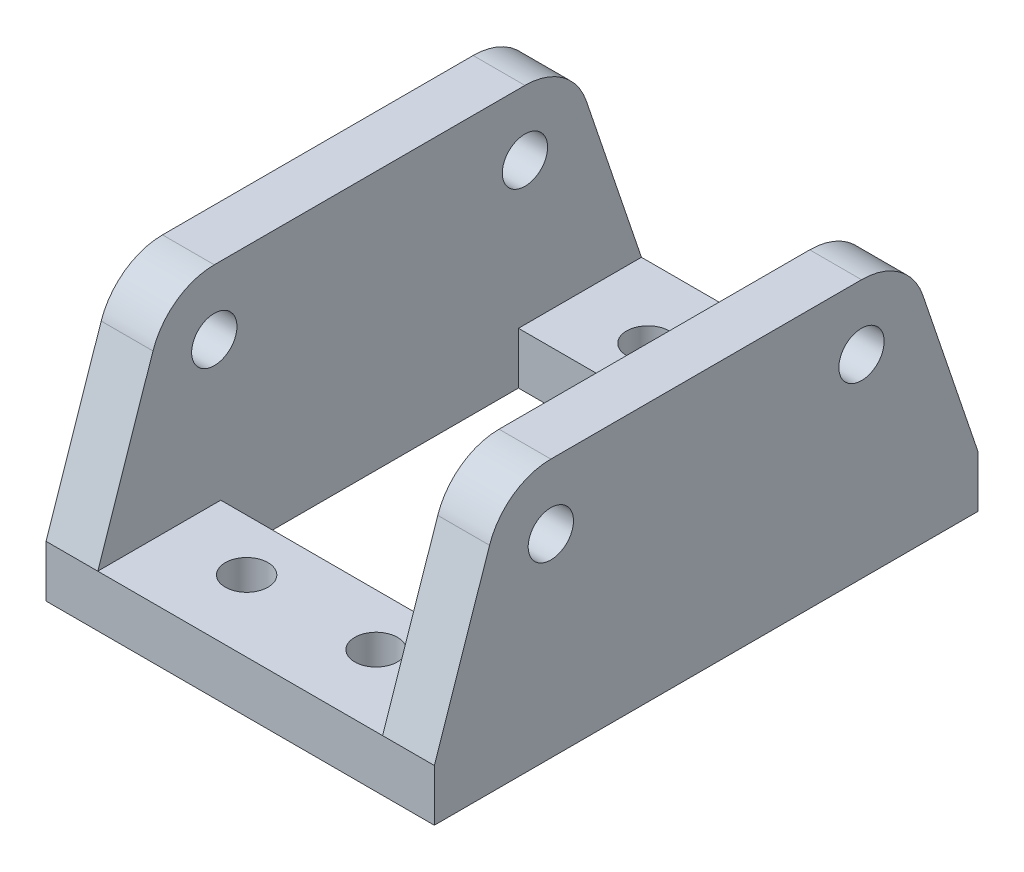
ISO-10303-21;
HEADER;
FILE_DESCRIPTION(('STEP AP214'),'2;1');
FILE_NAME('part.step','',(''),(''),'','','');
FILE_SCHEMA(('AUTOMOTIVE_DESIGN { 1 0 10303 214 1 1 1 1 }'));
ENDSEC;
DATA;
#1=APPLICATION_CONTEXT('core data for automotive mechanical design processes');
#2=APPLICATION_PROTOCOL_DEFINITION('international standard','automotive_design',2000,#1);
#3=PRODUCT_CONTEXT('',#1,'mechanical');
#4=PRODUCT('Part','Part','',(#3));
#5=PRODUCT_RELATED_PRODUCT_CATEGORY('part','',(#4));
#6=PRODUCT_DEFINITION_FORMATION('','',#4);
#7=PRODUCT_DEFINITION_CONTEXT('part definition',#1,'design');
#8=PRODUCT_DEFINITION('design','',#6,#7);
#9=PRODUCT_DEFINITION_SHAPE('','',#8);
#10=(LENGTH_UNIT() NAMED_UNIT(*) SI_UNIT(.MILLI.,.METRE.));
#11=(NAMED_UNIT(*) PLANE_ANGLE_UNIT() SI_UNIT($,.RADIAN.));
#12=(NAMED_UNIT(*) SI_UNIT($,.STERADIAN.) SOLID_ANGLE_UNIT());
#13=UNCERTAINTY_MEASURE_WITH_UNIT(LENGTH_MEASURE(1.E-05),#10,'distance_accuracy_value','');
#14=(GEOMETRIC_REPRESENTATION_CONTEXT(3) GLOBAL_UNCERTAINTY_ASSIGNED_CONTEXT((#13)) GLOBAL_UNIT_ASSIGNED_CONTEXT((#10,
#11,#12)) REPRESENTATION_CONTEXT('',''));
#15=CARTESIAN_POINT('',(0.,0.,0.));
#16=DIRECTION('',(0.,0.,1.));
#17=DIRECTION('',(1.,0.,0.));
#18=AXIS2_PLACEMENT_3D('',#15,#16,#17);
#19=CARTESIAN_POINT('',(0.,20.,0.));
#20=DIRECTION('',(0.,1.,0.));
#21=DIRECTION('',(0.,0.,1.));
#22=AXIS2_PLACEMENT_3D('',#19,#20,#21);
#23=PLANE('',#22);
#24=DIRECTION('',(0.,0.,1.));
#25=VECTOR('',#24,1.);
#26=CARTESIAN_POINT('',(-15.,20.,-25.));
#27=LINE('',#26,#25);
#28=CARTESIAN_POINT('',(-15.,20.,-12.));
#29=VERTEX_POINT('',#28);
#30=CARTESIAN_POINT('',(-15.,20.,12.));
#31=VERTEX_POINT('',#30);
#32=EDGE_CURVE('E45',#29,#31,#27,.T.);
#33=ORIENTED_EDGE('',*,*,#32,.T.);
#34=DIRECTION('',(-1.,0.,0.));
#35=VECTOR('',#34,1.);
#36=CARTESIAN_POINT('',(15.,20.,12.));
#37=LINE('',#36,#35);
#38=CARTESIAN_POINT('',(-11.,20.,12.));
#39=VERTEX_POINT('',#38);
#40=EDGE_CURVE('E85',#39,#31,#37,.T.);
#41=ORIENTED_EDGE('',*,*,#40,.F.);
#42=DIRECTION('',(0.,0.,1.));
#43=VECTOR('',#42,1.);
#44=CARTESIAN_POINT('',(-11.,20.,-21.));
#45=LINE('',#44,#43);
#46=CARTESIAN_POINT('',(-11.,20.,-12.));
#47=VERTEX_POINT('',#46);
#48=EDGE_CURVE('E120',#47,#39,#45,.T.);
#49=ORIENTED_EDGE('',*,*,#48,.F.);
#50=DIRECTION('',(-1.,0.,0.));
#51=VECTOR('',#50,1.);
#52=CARTESIAN_POINT('',(15.,20.,-12.));
#53=LINE('',#52,#51);
#54=EDGE_CURVE('E109',#47,#29,#53,.T.);
#55=ORIENTED_EDGE('',*,*,#54,.T.);
#56=EDGE_LOOP('',(#33,#41,#49,#55));
#57=FACE_BOUND('',#56,.T.);
#58=ADVANCED_FACE('F35',(#57),#23,.T.);
#59=DIRECTION('',(0.,0.,-1.));
#60=VECTOR('',#59,1.);
#61=CARTESIAN_POINT('',(11.,20.,-21.));
#62=LINE('',#61,#60);
#63=CARTESIAN_POINT('',(11.,20.,12.));
#64=VERTEX_POINT('',#63);
#65=CARTESIAN_POINT('',(11.,20.,-12.));
#66=VERTEX_POINT('',#65);
#67=EDGE_CURVE('E289',#64,#66,#62,.T.);
#68=ORIENTED_EDGE('',*,*,#67,.F.);
#69=CARTESIAN_POINT('',(15.,20.,12.));
#70=VERTEX_POINT('',#69);
#71=EDGE_CURVE('E96',#70,#64,#37,.T.);
#72=ORIENTED_EDGE('',*,*,#71,.F.);
#73=DIRECTION('',(0.,0.,-1.));
#74=VECTOR('',#73,1.);
#75=CARTESIAN_POINT('',(15.,20.,-25.));
#76=LINE('',#75,#74);
#77=CARTESIAN_POINT('',(15.,20.,-12.));
#78=VERTEX_POINT('',#77);
#79=EDGE_CURVE('E11',#70,#78,#76,.T.);
#80=ORIENTED_EDGE('',*,*,#79,.T.);
#81=EDGE_CURVE('E190',#78,#66,#53,.T.);
#82=ORIENTED_EDGE('',*,*,#81,.T.);
#83=EDGE_LOOP('',(#68,#72,#80,#82));
#84=FACE_BOUND('',#83,.T.);
#85=ADVANCED_FACE('F424',(#84),#23,.T.);
#86=CARTESIAN_POINT('',(11.,20.,-21.));
#87=DIRECTION('',(-1.,0.,0.));
#88=DIRECTION('',(0.,0.,1.));
#89=AXIS2_PLACEMENT_3D('',#86,#87,#88);
#90=PLANE('',#89);
#91=CARTESIAN_POINT('',(11.,15.,12.));
#92=DIRECTION('',(-1.,0.,0.));
#93=DIRECTION('',(0.,0.,1.));
#94=AXIS2_PLACEMENT_3D('',#91,#92,#93);
#95=CIRCLE('',#94,5.);
#96=CARTESIAN_POINT('',(11.,16.6024062440805,16.7362742983206));
#97=VERTEX_POINT('',#96);
#98=EDGE_CURVE('E171',#64,#97,#95,.F.);
#99=ORIENTED_EDGE('',*,*,#98,.F.);
#100=ORIENTED_EDGE('',*,*,#67,.T.);
#101=CARTESIAN_POINT('',(11.,15.,-12.));
#102=DIRECTION('',(-1.,0.,0.));
#103=DIRECTION('',(0.,0.,1.));
#104=AXIS2_PLACEMENT_3D('',#101,#102,#103);
#105=CIRCLE('',#104,4.99999999999999);
#106=CARTESIAN_POINT('',(11.,16.6024062440805,-16.7362742983206));
#107=VERTEX_POINT('',#106);
#108=EDGE_CURVE('E209',#107,#66,#105,.F.);
#109=ORIENTED_EDGE('',*,*,#108,.F.);
#110=DIRECTION('',(0.,0.947254859664113,0.320481248816093));
#111=VECTOR('',#110,1.);
#112=CARTESIAN_POINT('',(11.,18.3566683065164,-16.1427612740437));
#113=LINE('',#112,#111);
#114=CARTESIAN_POINT('',(11.,4.,-21.));
#115=VERTEX_POINT('',#114);
#116=EDGE_CURVE('E138',#115,#107,#113,.T.);
#117=ORIENTED_EDGE('',*,*,#116,.F.);
#118=DIRECTION('',(0.,0.,-1.));
#119=VECTOR('',#118,1.);
#120=CARTESIAN_POINT('',(11.,4.,-11.5));
#121=LINE('',#120,#119);
#122=CARTESIAN_POINT('',(11.,4.,-11.5));
#123=VERTEX_POINT('',#122);
#124=EDGE_CURVE('E261',#123,#115,#121,.T.);
#125=ORIENTED_EDGE('',*,*,#124,.F.);
#126=DIRECTION('',(0.,-1.,0.));
#127=VECTOR('',#126,1.);
#128=CARTESIAN_POINT('',(11.,4.,-11.5));
#129=LINE('',#128,#127);
#130=CARTESIAN_POINT('',(11.,0.,-11.5));
#131=VERTEX_POINT('',#130);
#132=EDGE_CURVE('E266',#123,#131,#129,.T.);
#133=ORIENTED_EDGE('',*,*,#132,.T.);
#134=DIRECTION('',(0.,0.,-1.));
#135=VECTOR('',#134,1.);
#136=CARTESIAN_POINT('',(11.,0.,-21.));
#137=LINE('',#136,#135);
#138=CARTESIAN_POINT('',(11.,0.,11.5));
#139=VERTEX_POINT('',#138);
#140=EDGE_CURVE('E288',#139,#131,#137,.T.);
#141=ORIENTED_EDGE('',*,*,#140,.F.);
#142=DIRECTION('',(0.,-1.,0.));
#143=VECTOR('',#142,1.);
#144=CARTESIAN_POINT('',(11.,4.,11.5));
#145=LINE('',#144,#143);
#146=CARTESIAN_POINT('',(11.,4.,11.5));
#147=VERTEX_POINT('',#146);
#148=EDGE_CURVE('E242',#147,#139,#145,.T.);
#149=ORIENTED_EDGE('',*,*,#148,.F.);
#150=DIRECTION('',(0.,0.,-1.));
#151=VECTOR('',#150,1.);
#152=CARTESIAN_POINT('',(11.,4.,11.5));
#153=LINE('',#152,#151);
#154=CARTESIAN_POINT('',(11.,4.,21.));
#155=VERTEX_POINT('',#154);
#156=EDGE_CURVE('E231',#155,#147,#153,.T.);
#157=ORIENTED_EDGE('',*,*,#156,.F.);
#158=DIRECTION('',(0.,-0.947254859664113,0.320481248816093));
#159=VECTOR('',#158,1.);
#160=CARTESIAN_POINT('',(11.,31.1069199621517,11.8290155786494));
#161=LINE('',#160,#159);
#162=EDGE_CURVE('E143',#97,#155,#161,.T.);
#163=ORIENTED_EDGE('',*,*,#162,.F.);
#164=EDGE_LOOP('',(#99,#100,#109,#117,#125,#133,#141,#149,#157,#163));
#165=FACE_BOUND('',#164,.T.);
#166=CARTESIAN_POINT('',(11.,15.,-12.));
#167=DIRECTION('',(-1.,0.,0.));
#168=DIRECTION('',(0.,0.,1.));
#169=AXIS2_PLACEMENT_3D('',#166,#167,#168);
#170=CIRCLE('',#169,1.75);
#171=CARTESIAN_POINT('',(11.,15.,-10.25));
#172=VERTEX_POINT('',#171);
#173=EDGE_CURVE('E130',#172,#172,#170,.T.);
#174=ORIENTED_EDGE('',*,*,#173,.F.);
#175=EDGE_LOOP('',(#174));
#176=FACE_BOUND('',#175,.T.);
#177=CARTESIAN_POINT('',(11.,15.,12.));
#178=DIRECTION('',(-1.,0.,0.));
#179=DIRECTION('',(0.,0.,1.));
#180=AXIS2_PLACEMENT_3D('',#177,#178,#179);
#181=CIRCLE('',#180,1.75);
#182=CARTESIAN_POINT('',(11.,15.,13.75));
#183=VERTEX_POINT('',#182);
#184=EDGE_CURVE('E125',#183,#183,#181,.T.);
#185=ORIENTED_EDGE('',*,*,#184,.F.);
#186=EDGE_LOOP('',(#185));
#187=FACE_BOUND('',#186,.T.);
#188=ADVANCED_FACE('F405',(#165,#176,#187),#90,.T.);
#189=CARTESIAN_POINT('',(-11.,20.,-21.));
#190=DIRECTION('',(1.,0.,0.));
#191=DIRECTION('',(0.,0.,-1.));
#192=AXIS2_PLACEMENT_3D('',#189,#190,#191);
#193=PLANE('',#192);
#194=CARTESIAN_POINT('',(-11.,15.,12.));
#195=DIRECTION('',(1.,0.,0.));
#196=DIRECTION('',(0.,0.,-1.));
#197=AXIS2_PLACEMENT_3D('',#194,#195,#196);
#198=CIRCLE('',#197,5.);
#199=CARTESIAN_POINT('',(-11.,16.6024062440805,16.7362742983206));
#200=VERTEX_POINT('',#199);
#201=EDGE_CURVE('E91',#200,#39,#198,.F.);
#202=ORIENTED_EDGE('',*,*,#201,.F.);
#203=DIRECTION('',(0.,0.947254859664113,-0.320481248816093));
#204=VECTOR('',#203,1.);
#205=CARTESIAN_POINT('',(-11.,31.1069199621517,11.8290155786494));
#206=LINE('',#205,#204);
#207=CARTESIAN_POINT('',(-11.,4.,21.));
#208=VERTEX_POINT('',#207);
#209=EDGE_CURVE('E139',#208,#200,#206,.T.);
#210=ORIENTED_EDGE('',*,*,#209,.F.);
#211=DIRECTION('',(0.,0.,1.));
#212=VECTOR('',#211,1.);
#213=CARTESIAN_POINT('',(-11.,4.,11.5));
#214=LINE('',#213,#212);
#215=CARTESIAN_POINT('',(-11.,4.,11.5));
#216=VERTEX_POINT('',#215);
#217=EDGE_CURVE('E225',#216,#208,#214,.T.);
#218=ORIENTED_EDGE('',*,*,#217,.F.);
#219=DIRECTION('',(0.,-1.,0.));
#220=VECTOR('',#219,1.);
#221=CARTESIAN_POINT('',(-11.,4.,11.5));
#222=LINE('',#221,#220);
#223=CARTESIAN_POINT('',(-11.,0.,11.5));
#224=VERTEX_POINT('',#223);
#225=EDGE_CURVE('E237',#216,#224,#222,.T.);
#226=ORIENTED_EDGE('',*,*,#225,.T.);
#227=DIRECTION('',(0.,0.,1.));
#228=VECTOR('',#227,1.);
#229=CARTESIAN_POINT('',(-11.,0.,-21.));
#230=LINE('',#229,#228);
#231=CARTESIAN_POINT('',(-11.,0.,-11.5));
#232=VERTEX_POINT('',#231);
#233=EDGE_CURVE('E116',#232,#224,#230,.T.);
#234=ORIENTED_EDGE('',*,*,#233,.F.);
#235=DIRECTION('',(0.,-1.,0.));
#236=VECTOR('',#235,1.);
#237=CARTESIAN_POINT('',(-11.,4.,-11.5));
#238=LINE('',#237,#236);
#239=CARTESIAN_POINT('',(-11.,4.,-11.5));
#240=VERTEX_POINT('',#239);
#241=EDGE_CURVE('E271',#240,#232,#238,.T.);
#242=ORIENTED_EDGE('',*,*,#241,.F.);
#243=DIRECTION('',(0.,0.,1.));
#244=VECTOR('',#243,1.);
#245=CARTESIAN_POINT('',(-11.,4.,-11.5));
#246=LINE('',#245,#244);
#247=CARTESIAN_POINT('',(-11.,4.,-21.));
#248=VERTEX_POINT('',#247);
#249=EDGE_CURVE('E54',#248,#240,#246,.T.);
#250=ORIENTED_EDGE('',*,*,#249,.F.);
#251=DIRECTION('',(0.,-0.947254859664113,-0.320481248816093));
#252=VECTOR('',#251,1.);
#253=CARTESIAN_POINT('',(-11.,18.3566683065164,-16.1427612740437));
#254=LINE('',#253,#252);
#255=CARTESIAN_POINT('',(-11.,16.6024062440805,-16.7362742983206));
#256=VERTEX_POINT('',#255);
#257=EDGE_CURVE('E134',#256,#248,#254,.T.);
#258=ORIENTED_EDGE('',*,*,#257,.F.);
#259=CARTESIAN_POINT('',(-11.,15.,-12.));
#260=DIRECTION('',(1.,0.,0.));
#261=DIRECTION('',(0.,0.,-1.));
#262=AXIS2_PLACEMENT_3D('',#259,#260,#261);
#263=CIRCLE('',#262,4.99999999999999);
#264=EDGE_CURVE('E137',#47,#256,#263,.F.);
#265=ORIENTED_EDGE('',*,*,#264,.F.);
#266=ORIENTED_EDGE('',*,*,#48,.T.);
#267=EDGE_LOOP('',(#202,#210,#218,#226,#234,#242,#250,#258,#265,#266));
#268=FACE_BOUND('',#267,.T.);
#269=CARTESIAN_POINT('',(-11.,15.,-12.));
#270=DIRECTION('',(1.,0.,0.));
#271=DIRECTION('',(0.,0.,-1.));
#272=AXIS2_PLACEMENT_3D('',#269,#270,#271);
#273=CIRCLE('',#272,1.75);
#274=CARTESIAN_POINT('',(-11.,15.,-13.75));
#275=VERTEX_POINT('',#274);
#276=EDGE_CURVE('E127',#275,#275,#273,.T.);
#277=ORIENTED_EDGE('',*,*,#276,.F.);
#278=EDGE_LOOP('',(#277));
#279=FACE_BOUND('',#278,.T.);
#280=CARTESIAN_POINT('',(-11.,15.,12.));
#281=DIRECTION('',(1.,0.,0.));
#282=DIRECTION('',(0.,0.,-1.));
#283=AXIS2_PLACEMENT_3D('',#280,#281,#282);
#284=CIRCLE('',#283,1.75);
#285=CARTESIAN_POINT('',(-11.,15.,10.25));
#286=VERTEX_POINT('',#285);
#287=EDGE_CURVE('E122',#286,#286,#284,.T.);
#288=ORIENTED_EDGE('',*,*,#287,.F.);
#289=EDGE_LOOP('',(#288));
#290=FACE_BOUND('',#289,.T.);
#291=ADVANCED_FACE('F308',(#268,#279,#290),#193,.T.);
#292=CARTESIAN_POINT('',(0.,0.,0.));
#293=DIRECTION('',(0.,1.,0.));
#294=DIRECTION('',(0.,0.,1.));
#295=AXIS2_PLACEMENT_3D('',#292,#293,#294);
#296=PLANE('',#295);
#297=DIRECTION('',(-1.,0.,0.));
#298=VECTOR('',#297,1.);
#299=CARTESIAN_POINT('',(-11.,0.,11.5));
#300=LINE('',#299,#298);
#301=EDGE_CURVE('E222',#139,#224,#300,.T.);
#302=ORIENTED_EDGE('',*,*,#301,.F.);
#303=ORIENTED_EDGE('',*,*,#140,.T.);
#304=DIRECTION('',(1.,0.,0.));
#305=VECTOR('',#304,1.);
#306=CARTESIAN_POINT('',(-11.,0.,-11.5));
#307=LINE('',#306,#305);
#308=EDGE_CURVE('E255',#232,#131,#307,.T.);
#309=ORIENTED_EDGE('',*,*,#308,.F.);
#310=ORIENTED_EDGE('',*,*,#233,.T.);
#311=EDGE_LOOP('',(#302,#303,#309,#310));
#312=FACE_BOUND('',#311,.T.);
#313=DIRECTION('',(0.,0.,-1.));
#314=VECTOR('',#313,1.);
#315=CARTESIAN_POINT('',(15.,0.,-25.));
#316=LINE('',#315,#314);
#317=CARTESIAN_POINT('',(15.,0.,21.));
#318=VERTEX_POINT('',#317);
#319=CARTESIAN_POINT('',(15.,0.,-21.));
#320=VERTEX_POINT('',#319);
#321=EDGE_CURVE('E110',#318,#320,#316,.T.);
#322=ORIENTED_EDGE('',*,*,#321,.F.);
#323=DIRECTION('',(-1.,0.,0.));
#324=VECTOR('',#323,1.);
#325=CARTESIAN_POINT('',(15.,0.,21.));
#326=LINE('',#325,#324);
#327=CARTESIAN_POINT('',(-15.,0.,21.));
#328=VERTEX_POINT('',#327);
#329=EDGE_CURVE('E97',#318,#328,#326,.T.);
#330=ORIENTED_EDGE('',*,*,#329,.T.);
#331=DIRECTION('',(0.,0.,1.));
#332=VECTOR('',#331,1.);
#333=CARTESIAN_POINT('',(-15.,0.,-25.));
#334=LINE('',#333,#332);
#335=CARTESIAN_POINT('',(-15.,0.,-21.));
#336=VERTEX_POINT('',#335);
#337=EDGE_CURVE('E113',#336,#328,#334,.T.);
#338=ORIENTED_EDGE('',*,*,#337,.F.);
#339=DIRECTION('',(-1.,0.,0.));
#340=VECTOR('',#339,1.);
#341=CARTESIAN_POINT('',(15.,0.,-21.));
#342=LINE('',#341,#340);
#343=EDGE_CURVE('E182',#320,#336,#342,.T.);
#344=ORIENTED_EDGE('',*,*,#343,.F.);
#345=EDGE_LOOP('',(#322,#330,#338,#344));
#346=FACE_BOUND('',#345,.T.);
#347=CARTESIAN_POINT('',(-5.,0.,-15.5));
#348=DIRECTION('',(0.,1.,0.));
#349=DIRECTION('',(0.,0.,1.));
#350=AXIS2_PLACEMENT_3D('',#347,#348,#349);
#351=CIRCLE('',#350,1.65);
#352=CARTESIAN_POINT('',(-5.,0.,-13.85));
#353=VERTEX_POINT('',#352);
#354=EDGE_CURVE('E249',#353,#353,#351,.T.);
#355=ORIENTED_EDGE('',*,*,#354,.T.);
#356=EDGE_LOOP('',(#355));
#357=FACE_BOUND('',#356,.T.);
#358=CARTESIAN_POINT('',(4.99999999999999,0.,-15.5));
#359=DIRECTION('',(0.,1.,0.));
#360=DIRECTION('',(0.,0.,-1.));
#361=AXIS2_PLACEMENT_3D('',#358,#359,#360);
#362=CIRCLE('',#361,1.65);
#363=CARTESIAN_POINT('',(4.99999999999999,0.,-17.15));
#364=VERTEX_POINT('',#363);
#365=EDGE_CURVE('E245',#364,#364,#362,.T.);
#366=ORIENTED_EDGE('',*,*,#365,.T.);
#367=EDGE_LOOP('',(#366));
#368=FACE_BOUND('',#367,.T.);
#369=CARTESIAN_POINT('',(-5.,0.,15.5));
#370=DIRECTION('',(0.,1.,0.));
#371=DIRECTION('',(0.,0.,1.));
#372=AXIS2_PLACEMENT_3D('',#369,#370,#371);
#373=CIRCLE('',#372,1.65);
#374=CARTESIAN_POINT('',(-5.,0.,17.15));
#375=VERTEX_POINT('',#374);
#376=EDGE_CURVE('E216',#375,#375,#373,.T.);
#377=ORIENTED_EDGE('',*,*,#376,.T.);
#378=EDGE_LOOP('',(#377));
#379=FACE_BOUND('',#378,.T.);
#380=CARTESIAN_POINT('',(5.,0.,15.5));
#381=DIRECTION('',(0.,1.,0.));
#382=DIRECTION('',(0.,0.,-1.));
#383=AXIS2_PLACEMENT_3D('',#380,#381,#382);
#384=CIRCLE('',#383,1.65);
#385=CARTESIAN_POINT('',(5.,0.,13.85));
#386=VERTEX_POINT('',#385);
#387=EDGE_CURVE('E212',#386,#386,#384,.T.);
#388=ORIENTED_EDGE('',*,*,#387,.T.);
#389=EDGE_LOOP('',(#388));
#390=FACE_BOUND('',#389,.T.);
#391=ADVANCED_FACE('F300',(#312,#346,#357,#368,#379,#390),#296,.F.);
#392=CARTESIAN_POINT('',(-15.,20.,-25.));
#393=DIRECTION('',(1.,0.,0.));
#394=DIRECTION('',(0.,0.,-1.));
#395=AXIS2_PLACEMENT_3D('',#392,#393,#394);
#396=PLANE('',#395);
#397=CARTESIAN_POINT('',(-15.,15.,-12.));
#398=DIRECTION('',(1.,0.,0.));
#399=DIRECTION('',(0.,0.,-1.));
#400=AXIS2_PLACEMENT_3D('',#397,#398,#399);
#401=CIRCLE('',#400,1.75);
#402=CARTESIAN_POINT('',(-15.,15.,-13.75));
#403=VERTEX_POINT('',#402);
#404=EDGE_CURVE('E131',#403,#403,#401,.T.);
#405=ORIENTED_EDGE('',*,*,#404,.T.);
#406=EDGE_LOOP('',(#405));
#407=FACE_BOUND('',#406,.T.);
#408=CARTESIAN_POINT('',(-15.,15.,12.));
#409=DIRECTION('',(1.,0.,0.));
#410=DIRECTION('',(0.,0.,-1.));
#411=AXIS2_PLACEMENT_3D('',#408,#409,#410);
#412=CIRCLE('',#411,1.75);
#413=CARTESIAN_POINT('',(-15.,15.,10.25));
#414=VERTEX_POINT('',#413);
#415=EDGE_CURVE('E126',#414,#414,#412,.T.);
#416=ORIENTED_EDGE('',*,*,#415,.T.);
#417=EDGE_LOOP('',(#416));
#418=FACE_BOUND('',#417,.T.);
#419=DIRECTION('',(0.,0.947254859664113,-0.320481248816093));
#420=VECTOR('',#419,1.);
#421=CARTESIAN_POINT('',(-15.,16.6024062440805,16.7362742983206));
#422=LINE('',#421,#420);
#423=CARTESIAN_POINT('',(-15.,16.6024062440805,16.7362742983206));
#424=VERTEX_POINT('',#423);
#425=CARTESIAN_POINT('',(-15.,3.99999999999999,21.));
#426=VERTEX_POINT('',#425);
#427=EDGE_CURVE('E105',#424,#426,#422,.F.);
#428=ORIENTED_EDGE('',*,*,#427,.F.);
#429=CARTESIAN_POINT('',(-15.,15.,12.));
#430=DIRECTION('',(-1.,0.,0.));
#431=DIRECTION('',(0.,0.,1.));
#432=AXIS2_PLACEMENT_3D('',#429,#430,#431);
#433=CIRCLE('',#432,5.);
#434=EDGE_CURVE('E39',#31,#424,#433,.F.);
#435=ORIENTED_EDGE('',*,*,#434,.F.);
#436=ORIENTED_EDGE('',*,*,#32,.F.);
#437=CARTESIAN_POINT('',(-15.,15.,-12.));
#438=DIRECTION('',(-1.,0.,0.));
#439=DIRECTION('',(0.,0.,1.));
#440=AXIS2_PLACEMENT_3D('',#437,#438,#439);
#441=CIRCLE('',#440,4.99999999999999);
#442=CARTESIAN_POINT('',(-15.,16.6024062440805,-16.7362742983206));
#443=VERTEX_POINT('',#442);
#444=EDGE_CURVE('E136',#443,#29,#441,.F.);
#445=ORIENTED_EDGE('',*,*,#444,.F.);
#446=DIRECTION('',(0.,-0.947254859664113,-0.320481248816093));
#447=VECTOR('',#446,1.);
#448=CARTESIAN_POINT('',(-15.,16.6024062440805,-16.7362742983206));
#449=LINE('',#448,#447);
#450=CARTESIAN_POINT('',(-15.,4.,-21.));
#451=VERTEX_POINT('',#450);
#452=EDGE_CURVE('E132',#451,#443,#449,.F.);
#453=ORIENTED_EDGE('',*,*,#452,.F.);
#454=DIRECTION('',(0.,-1.,0.));
#455=VECTOR('',#454,1.);
#456=CARTESIAN_POINT('',(-15.,20.,-21.));
#457=LINE('',#456,#455);
#458=EDGE_CURVE('E135',#451,#336,#457,.T.);
#459=ORIENTED_EDGE('',*,*,#458,.T.);
#460=ORIENTED_EDGE('',*,*,#337,.T.);
#461=DIRECTION('',(0.,1.,0.));
#462=VECTOR('',#461,1.);
#463=CARTESIAN_POINT('',(-15.,20.,21.));
#464=LINE('',#463,#462);
#465=EDGE_CURVE('E106',#328,#426,#464,.T.);
#466=ORIENTED_EDGE('',*,*,#465,.T.);
#467=EDGE_LOOP('',(#428,#435,#436,#445,#453,#459,#460,#466));
#468=FACE_BOUND('',#467,.T.);
#469=ADVANCED_FACE('F37',(#407,#418,#468),#396,.F.);
#470=CARTESIAN_POINT('',(15.,20.,-25.));
#471=DIRECTION('',(-1.,0.,0.));
#472=DIRECTION('',(0.,0.,1.));
#473=AXIS2_PLACEMENT_3D('',#470,#471,#472);
#474=PLANE('',#473);
#475=ORIENTED_EDGE('',*,*,#79,.F.);
#476=CARTESIAN_POINT('',(15.,15.,12.));
#477=DIRECTION('',(1.,0.,0.));
#478=DIRECTION('',(0.,0.,-1.));
#479=AXIS2_PLACEMENT_3D('',#476,#477,#478);
#480=CIRCLE('',#479,5.);
#481=CARTESIAN_POINT('',(15.,16.6024062440805,16.7362742983206));
#482=VERTEX_POINT('',#481);
#483=EDGE_CURVE('E363',#70,#482,#480,.T.);
#484=ORIENTED_EDGE('',*,*,#483,.T.);
#485=DIRECTION('',(0.,-0.947254859664113,0.320481248816093));
#486=VECTOR('',#485,1.);
#487=CARTESIAN_POINT('',(15.,16.6024062440805,16.7362742983206));
#488=LINE('',#487,#486);
#489=CARTESIAN_POINT('',(15.,4.,21.));
#490=VERTEX_POINT('',#489);
#491=EDGE_CURVE('E367',#482,#490,#488,.T.);
#492=ORIENTED_EDGE('',*,*,#491,.T.);
#493=DIRECTION('',(0.,-1.,0.));
#494=VECTOR('',#493,1.);
#495=CARTESIAN_POINT('',(15.,4.,21.));
#496=LINE('',#495,#494);
#497=EDGE_CURVE('E372',#490,#318,#496,.T.);
#498=ORIENTED_EDGE('',*,*,#497,.T.);
#499=ORIENTED_EDGE('',*,*,#321,.T.);
#500=DIRECTION('',(0.,1.,0.));
#501=VECTOR('',#500,1.);
#502=CARTESIAN_POINT('',(15.,4.,-21.));
#503=LINE('',#502,#501);
#504=CARTESIAN_POINT('',(15.,4.,-21.));
#505=VERTEX_POINT('',#504);
#506=EDGE_CURVE('E173',#320,#505,#503,.T.);
#507=ORIENTED_EDGE('',*,*,#506,.T.);
#508=DIRECTION('',(0.,0.947254859664113,0.320481248816093));
#509=VECTOR('',#508,1.);
#510=CARTESIAN_POINT('',(15.,16.6024062440805,-16.7362742983206));
#511=LINE('',#510,#509);
#512=CARTESIAN_POINT('',(15.,16.6024062440805,-16.7362742983206));
#513=VERTEX_POINT('',#512);
#514=EDGE_CURVE('E176',#505,#513,#511,.T.);
#515=ORIENTED_EDGE('',*,*,#514,.T.);
#516=CARTESIAN_POINT('',(15.,15.,-12.));
#517=DIRECTION('',(1.,0.,0.));
#518=DIRECTION('',(0.,0.,1.));
#519=AXIS2_PLACEMENT_3D('',#516,#517,#518);
#520=CIRCLE('',#519,4.99999999999999);
#521=EDGE_CURVE('E179',#513,#78,#520,.T.);
#522=ORIENTED_EDGE('',*,*,#521,.T.);
#523=EDGE_LOOP('',(#475,#484,#492,#498,#499,#507,#515,#522));
#524=FACE_BOUND('',#523,.T.);
#525=CARTESIAN_POINT('',(15.,15.,-12.));
#526=DIRECTION('',(1.,0.,0.));
#527=DIRECTION('',(0.,0.,-1.));
#528=AXIS2_PLACEMENT_3D('',#525,#526,#527);
#529=CIRCLE('',#528,1.75);
#530=CARTESIAN_POINT('',(15.,15.,-13.75));
#531=VERTEX_POINT('',#530);
#532=EDGE_CURVE('E274',#531,#531,#529,.T.);
#533=ORIENTED_EDGE('',*,*,#532,.F.);
#534=EDGE_LOOP('',(#533));
#535=FACE_BOUND('',#534,.T.);
#536=CARTESIAN_POINT('',(15.,15.,12.));
#537=DIRECTION('',(1.,0.,0.));
#538=DIRECTION('',(0.,0.,-1.));
#539=AXIS2_PLACEMENT_3D('',#536,#537,#538);
#540=CIRCLE('',#539,1.75);
#541=CARTESIAN_POINT('',(15.,15.,10.25));
#542=VERTEX_POINT('',#541);
#543=EDGE_CURVE('E281',#542,#542,#540,.T.);
#544=ORIENTED_EDGE('',*,*,#543,.F.);
#545=EDGE_LOOP('',(#544));
#546=FACE_BOUND('',#545,.T.);
#547=ADVANCED_FACE('F375',(#524,#535,#546),#474,.F.);
#548=CARTESIAN_POINT('',(-15.,15.,12.));
#549=DIRECTION('',(1.,0.,0.));
#550=DIRECTION('',(0.,0.,-1.));
#551=AXIS2_PLACEMENT_3D('',#548,#549,#550);
#552=CYLINDRICAL_SURFACE('',#551,1.75);
#553=ORIENTED_EDGE('',*,*,#287,.T.);
#554=EDGE_LOOP('',(#553));
#555=FACE_BOUND('',#554,.T.);
#556=ORIENTED_EDGE('',*,*,#415,.F.);
#557=EDGE_LOOP('',(#556));
#558=FACE_BOUND('',#557,.T.);
#559=ADVANCED_FACE('F435',(#555,#558),#552,.F.);
#560=ORIENTED_EDGE('',*,*,#184,.T.);
#561=EDGE_LOOP('',(#560));
#562=FACE_BOUND('',#561,.T.);
#563=ORIENTED_EDGE('',*,*,#543,.T.);
#564=EDGE_LOOP('',(#563));
#565=FACE_BOUND('',#564,.T.);
#566=ADVANCED_FACE('F440',(#562,#565),#552,.F.);
#567=CARTESIAN_POINT('',(-15.,15.,-12.));
#568=DIRECTION('',(1.,0.,0.));
#569=DIRECTION('',(0.,0.,-1.));
#570=AXIS2_PLACEMENT_3D('',#567,#568,#569);
#571=CYLINDRICAL_SURFACE('',#570,1.75);
#572=ORIENTED_EDGE('',*,*,#276,.T.);
#573=EDGE_LOOP('',(#572));
#574=FACE_BOUND('',#573,.T.);
#575=ORIENTED_EDGE('',*,*,#404,.F.);
#576=EDGE_LOOP('',(#575));
#577=FACE_BOUND('',#576,.T.);
#578=ADVANCED_FACE('F451',(#574,#577),#571,.F.);
#579=ORIENTED_EDGE('',*,*,#173,.T.);
#580=EDGE_LOOP('',(#579));
#581=FACE_BOUND('',#580,.T.);
#582=ORIENTED_EDGE('',*,*,#532,.T.);
#583=EDGE_LOOP('',(#582));
#584=FACE_BOUND('',#583,.T.);
#585=ADVANCED_FACE('F453',(#581,#584),#571,.F.);
#586=CARTESIAN_POINT('',(0.,4.,0.));
#587=DIRECTION('',(0.,-1.,0.));
#588=DIRECTION('',(0.,0.,-1.));
#589=AXIS2_PLACEMENT_3D('',#586,#587,#588);
#590=PLANE('',#589);
#591=ORIENTED_EDGE('',*,*,#249,.T.);
#592=DIRECTION('',(1.,0.,0.));
#593=VECTOR('',#592,1.);
#594=CARTESIAN_POINT('',(-11.,4.,-11.5));
#595=LINE('',#594,#593);
#596=EDGE_CURVE('E259',#240,#123,#595,.T.);
#597=ORIENTED_EDGE('',*,*,#596,.T.);
#598=ORIENTED_EDGE('',*,*,#124,.T.);
#599=DIRECTION('',(-1.,0.,0.));
#600=VECTOR('',#599,1.);
#601=CARTESIAN_POINT('',(-11.,4.,-21.));
#602=LINE('',#601,#600);
#603=EDGE_CURVE('E264',#115,#248,#602,.T.);
#604=ORIENTED_EDGE('',*,*,#603,.T.);
#605=EDGE_LOOP('',(#591,#597,#598,#604));
#606=FACE_BOUND('',#605,.T.);
#607=CARTESIAN_POINT('',(-5.,4.,-15.5));
#608=DIRECTION('',(0.,1.,0.));
#609=DIRECTION('',(0.,0.,1.));
#610=AXIS2_PLACEMENT_3D('',#607,#608,#609);
#611=CIRCLE('',#610,1.65);
#612=CARTESIAN_POINT('',(-5.,4.,-13.85));
#613=VERTEX_POINT('',#612);
#614=EDGE_CURVE('E252',#613,#613,#611,.T.);
#615=ORIENTED_EDGE('',*,*,#614,.F.);
#616=EDGE_LOOP('',(#615));
#617=FACE_BOUND('',#616,.T.);
#618=CARTESIAN_POINT('',(4.99999999999999,4.,-15.5));
#619=DIRECTION('',(0.,1.,0.));
#620=DIRECTION('',(0.,0.,-1.));
#621=AXIS2_PLACEMENT_3D('',#618,#619,#620);
#622=CIRCLE('',#621,1.65);
#623=CARTESIAN_POINT('',(4.99999999999999,4.,-17.15));
#624=VERTEX_POINT('',#623);
#625=EDGE_CURVE('E246',#624,#624,#622,.T.);
#626=ORIENTED_EDGE('',*,*,#625,.F.);
#627=EDGE_LOOP('',(#626));
#628=FACE_BOUND('',#627,.T.);
#629=ADVANCED_FACE('F460',(#606,#617,#628),#590,.F.);
#630=CARTESIAN_POINT('',(-11.,4.,-11.5));
#631=DIRECTION('',(0.,0.,-1.));
#632=DIRECTION('',(-1.,0.,0.));
#633=AXIS2_PLACEMENT_3D('',#630,#631,#632);
#634=PLANE('',#633);
#635=ORIENTED_EDGE('',*,*,#308,.T.);
#636=ORIENTED_EDGE('',*,*,#132,.F.);
#637=ORIENTED_EDGE('',*,*,#596,.F.);
#638=ORIENTED_EDGE('',*,*,#241,.T.);
#639=EDGE_LOOP('',(#635,#636,#637,#638));
#640=FACE_BOUND('',#639,.T.);
#641=ADVANCED_FACE('F464',(#640),#634,.F.);
#642=CARTESIAN_POINT('',(-5.,4.,-15.5));
#643=DIRECTION('',(0.,-1.,0.));
#644=DIRECTION('',(0.,0.,-1.));
#645=AXIS2_PLACEMENT_3D('',#642,#643,#644);
#646=CYLINDRICAL_SURFACE('',#645,1.65);
#647=ORIENTED_EDGE('',*,*,#614,.T.);
#648=EDGE_LOOP('',(#647));
#649=FACE_BOUND('',#648,.T.);
#650=ORIENTED_EDGE('',*,*,#354,.F.);
#651=EDGE_LOOP('',(#650));
#652=FACE_BOUND('',#651,.T.);
#653=ADVANCED_FACE('F512',(#649,#652),#646,.F.);
#654=CARTESIAN_POINT('',(4.99999999999999,4.,-15.5));
#655=DIRECTION('',(0.,-1.,0.));
#656=DIRECTION('',(0.,0.,-1.));
#657=AXIS2_PLACEMENT_3D('',#654,#655,#656);
#658=CYLINDRICAL_SURFACE('',#657,1.65);
#659=ORIENTED_EDGE('',*,*,#625,.T.);
#660=EDGE_LOOP('',(#659));
#661=FACE_BOUND('',#660,.T.);
#662=ORIENTED_EDGE('',*,*,#365,.F.);
#663=EDGE_LOOP('',(#662));
#664=FACE_BOUND('',#663,.T.);
#665=ADVANCED_FACE('F419',(#661,#664),#658,.F.);
#666=CARTESIAN_POINT('',(0.,4.,0.));
#667=DIRECTION('',(0.,1.,0.));
#668=DIRECTION('',(0.,0.,1.));
#669=AXIS2_PLACEMENT_3D('',#666,#667,#668);
#670=PLANE('',#669);
#671=CARTESIAN_POINT('',(-5.,4.,15.5));
#672=DIRECTION('',(0.,1.,0.));
#673=DIRECTION('',(0.,0.,1.));
#674=AXIS2_PLACEMENT_3D('',#671,#672,#673);
#675=CIRCLE('',#674,1.65);
#676=CARTESIAN_POINT('',(-5.,4.,17.15));
#677=VERTEX_POINT('',#676);
#678=EDGE_CURVE('E219',#677,#677,#675,.T.);
#679=ORIENTED_EDGE('',*,*,#678,.F.);
#680=EDGE_LOOP('',(#679));
#681=FACE_BOUND('',#680,.T.);
#682=ORIENTED_EDGE('',*,*,#217,.T.);
#683=DIRECTION('',(1.,0.,0.));
#684=VECTOR('',#683,1.);
#685=CARTESIAN_POINT('',(-11.,4.,21.));
#686=LINE('',#685,#684);
#687=EDGE_CURVE('E228',#208,#155,#686,.T.);
#688=ORIENTED_EDGE('',*,*,#687,.T.);
#689=ORIENTED_EDGE('',*,*,#156,.T.);
#690=DIRECTION('',(-1.,0.,0.));
#691=VECTOR('',#690,1.);
#692=CARTESIAN_POINT('',(-11.,4.,11.5));
#693=LINE('',#692,#691);
#694=EDGE_CURVE('E234',#147,#216,#693,.T.);
#695=ORIENTED_EDGE('',*,*,#694,.T.);
#696=EDGE_LOOP('',(#682,#688,#689,#695));
#697=FACE_BOUND('',#696,.T.);
#698=CARTESIAN_POINT('',(5.,4.,15.5));
#699=DIRECTION('',(0.,1.,0.));
#700=DIRECTION('',(0.,0.,-1.));
#701=AXIS2_PLACEMENT_3D('',#698,#699,#700);
#702=CIRCLE('',#701,1.65);
#703=CARTESIAN_POINT('',(5.,4.,13.85));
#704=VERTEX_POINT('',#703);
#705=EDGE_CURVE('E213',#704,#704,#702,.T.);
#706=ORIENTED_EDGE('',*,*,#705,.F.);
#707=EDGE_LOOP('',(#706));
#708=FACE_BOUND('',#707,.T.);
#709=ADVANCED_FACE('F400',(#681,#697,#708),#670,.T.);
#710=CARTESIAN_POINT('',(-11.,4.,11.5));
#711=DIRECTION('',(0.,0.,1.));
#712=DIRECTION('',(1.,0.,0.));
#713=AXIS2_PLACEMENT_3D('',#710,#711,#712);
#714=PLANE('',#713);
#715=ORIENTED_EDGE('',*,*,#301,.T.);
#716=ORIENTED_EDGE('',*,*,#225,.F.);
#717=ORIENTED_EDGE('',*,*,#694,.F.);
#718=ORIENTED_EDGE('',*,*,#148,.T.);
#719=EDGE_LOOP('',(#715,#716,#717,#718));
#720=FACE_BOUND('',#719,.T.);
#721=ADVANCED_FACE('F408',(#720),#714,.F.);
#722=CARTESIAN_POINT('',(-5.,4.,15.5));
#723=DIRECTION('',(0.,-1.,0.));
#724=DIRECTION('',(0.,0.,-1.));
#725=AXIS2_PLACEMENT_3D('',#722,#723,#724);
#726=CYLINDRICAL_SURFACE('',#725,1.65);
#727=ORIENTED_EDGE('',*,*,#678,.T.);
#728=EDGE_LOOP('',(#727));
#729=FACE_BOUND('',#728,.T.);
#730=ORIENTED_EDGE('',*,*,#376,.F.);
#731=EDGE_LOOP('',(#730));
#732=FACE_BOUND('',#731,.T.);
#733=ADVANCED_FACE('F410',(#729,#732),#726,.F.);
#734=CARTESIAN_POINT('',(5.,4.,15.5));
#735=DIRECTION('',(0.,-1.,0.));
#736=DIRECTION('',(0.,0.,-1.));
#737=AXIS2_PLACEMENT_3D('',#734,#735,#736);
#738=CYLINDRICAL_SURFACE('',#737,1.65);
#739=ORIENTED_EDGE('',*,*,#705,.T.);
#740=EDGE_LOOP('',(#739));
#741=FACE_BOUND('',#740,.T.);
#742=ORIENTED_EDGE('',*,*,#387,.F.);
#743=EDGE_LOOP('',(#742));
#744=FACE_BOUND('',#743,.T.);
#745=ADVANCED_FACE('F416',(#741,#744),#738,.F.);
#746=CARTESIAN_POINT('',(15.,15.,-12.));
#747=DIRECTION('',(-1.,0.,0.));
#748=DIRECTION('',(0.,0.,1.));
#749=AXIS2_PLACEMENT_3D('',#746,#747,#748);
#750=CYLINDRICAL_SURFACE('',#749,4.99999999999999);
#751=ORIENTED_EDGE('',*,*,#108,.T.);
#752=ORIENTED_EDGE('',*,*,#81,.F.);
#753=ORIENTED_EDGE('',*,*,#521,.F.);
#754=DIRECTION('',(-1.,0.,0.));
#755=VECTOR('',#754,1.);
#756=CARTESIAN_POINT('',(15.,16.6024062440805,-16.7362742983206));
#757=LINE('',#756,#755);
#758=EDGE_CURVE('E186',#513,#107,#757,.T.);
#759=ORIENTED_EDGE('',*,*,#758,.T.);
#760=EDGE_LOOP('',(#751,#752,#753,#759));
#761=FACE_BOUND('',#760,.T.);
#762=ADVANCED_FACE('F490',(#761),#750,.T.);
#763=ORIENTED_EDGE('',*,*,#264,.T.);
#764=EDGE_CURVE('E189',#256,#443,#757,.T.);
#765=ORIENTED_EDGE('',*,*,#764,.T.);
#766=ORIENTED_EDGE('',*,*,#444,.T.);
#767=ORIENTED_EDGE('',*,*,#54,.F.);
#768=EDGE_LOOP('',(#763,#765,#766,#767));
#769=FACE_BOUND('',#768,.T.);
#770=ADVANCED_FACE('F386',(#769),#750,.T.);
#771=CARTESIAN_POINT('',(15.,16.6024062440805,-16.7362742983206));
#772=DIRECTION('',(0.,-0.320481248816093,0.947254859664112));
#773=DIRECTION('',(0.,-0.947254859664113,-0.320481248816093));
#774=AXIS2_PLACEMENT_3D('',#771,#772,#773);
#775=PLANE('',#774);
#776=ORIENTED_EDGE('',*,*,#116,.T.);
#777=ORIENTED_EDGE('',*,*,#758,.F.);
#778=ORIENTED_EDGE('',*,*,#514,.F.);
#779=DIRECTION('',(-1.,0.,0.));
#780=VECTOR('',#779,1.);
#781=CARTESIAN_POINT('',(15.,4.,-21.));
#782=LINE('',#781,#780);
#783=EDGE_CURVE('E195',#505,#115,#782,.T.);
#784=ORIENTED_EDGE('',*,*,#783,.T.);
#785=EDGE_LOOP('',(#776,#777,#778,#784));
#786=FACE_BOUND('',#785,.T.);
#787=ADVANCED_FACE('F621',(#786),#775,.F.);
#788=ORIENTED_EDGE('',*,*,#257,.T.);
#789=EDGE_CURVE('E185',#248,#451,#782,.T.);
#790=ORIENTED_EDGE('',*,*,#789,.T.);
#791=ORIENTED_EDGE('',*,*,#452,.T.);
#792=ORIENTED_EDGE('',*,*,#764,.F.);
#793=EDGE_LOOP('',(#788,#790,#791,#792));
#794=FACE_BOUND('',#793,.T.);
#795=ADVANCED_FACE('F388',(#794),#775,.F.);
#796=CARTESIAN_POINT('',(15.,4.,-21.));
#797=DIRECTION('',(0.,0.,1.));
#798=DIRECTION('',(1.,0.,0.));
#799=AXIS2_PLACEMENT_3D('',#796,#797,#798);
#800=PLANE('',#799);
#801=ORIENTED_EDGE('',*,*,#789,.F.);
#802=ORIENTED_EDGE('',*,*,#603,.F.);
#803=ORIENTED_EDGE('',*,*,#783,.F.);
#804=ORIENTED_EDGE('',*,*,#506,.F.);
#805=ORIENTED_EDGE('',*,*,#343,.T.);
#806=ORIENTED_EDGE('',*,*,#458,.F.);
#807=EDGE_LOOP('',(#801,#802,#803,#804,#805,#806));
#808=FACE_BOUND('',#807,.T.);
#809=ADVANCED_FACE('F638',(#808),#800,.F.);
#810=CARTESIAN_POINT('',(15.,15.,12.));
#811=DIRECTION('',(-1.,0.,0.));
#812=DIRECTION('',(0.,0.,1.));
#813=AXIS2_PLACEMENT_3D('',#810,#811,#812);
#814=CYLINDRICAL_SURFACE('',#813,5.);
#815=ORIENTED_EDGE('',*,*,#98,.T.);
#816=DIRECTION('',(-1.,0.,0.));
#817=VECTOR('',#816,1.);
#818=CARTESIAN_POINT('',(15.,16.6024062440805,16.7362742983206));
#819=LINE('',#818,#817);
#820=EDGE_CURVE('E157',#482,#97,#819,.T.);
#821=ORIENTED_EDGE('',*,*,#820,.F.);
#822=ORIENTED_EDGE('',*,*,#483,.F.);
#823=ORIENTED_EDGE('',*,*,#71,.T.);
#824=EDGE_LOOP('',(#815,#821,#822,#823));
#825=FACE_BOUND('',#824,.T.);
#826=ADVANCED_FACE('F361',(#825),#814,.T.);
#827=ORIENTED_EDGE('',*,*,#201,.T.);
#828=ORIENTED_EDGE('',*,*,#40,.T.);
#829=ORIENTED_EDGE('',*,*,#434,.T.);
#830=EDGE_CURVE('E161',#200,#424,#819,.T.);
#831=ORIENTED_EDGE('',*,*,#830,.F.);
#832=EDGE_LOOP('',(#827,#828,#829,#831));
#833=FACE_BOUND('',#832,.T.);
#834=ADVANCED_FACE('F87',(#833),#814,.T.);
#835=CARTESIAN_POINT('',(15.,4.,21.));
#836=DIRECTION('',(0.,0.,-1.));
#837=DIRECTION('',(-1.,0.,0.));
#838=AXIS2_PLACEMENT_3D('',#835,#836,#837);
#839=PLANE('',#838);
#840=ORIENTED_EDGE('',*,*,#329,.F.);
#841=ORIENTED_EDGE('',*,*,#497,.F.);
#842=DIRECTION('',(-1.,0.,0.));
#843=VECTOR('',#842,1.);
#844=CARTESIAN_POINT('',(15.,4.,21.));
#845=LINE('',#844,#843);
#846=EDGE_CURVE('E162',#490,#155,#845,.T.);
#847=ORIENTED_EDGE('',*,*,#846,.T.);
#848=ORIENTED_EDGE('',*,*,#687,.F.);
#849=EDGE_CURVE('E160',#208,#426,#845,.T.);
#850=ORIENTED_EDGE('',*,*,#849,.T.);
#851=ORIENTED_EDGE('',*,*,#465,.F.);
#852=EDGE_LOOP('',(#840,#841,#847,#848,#850,#851));
#853=FACE_BOUND('',#852,.T.);
#854=ADVANCED_FACE('F396',(#853),#839,.F.);
#855=CARTESIAN_POINT('',(15.,16.6024062440805,16.7362742983206));
#856=DIRECTION('',(0.,-0.320481248816093,-0.947254859664112));
#857=DIRECTION('',(0.,0.947254859664113,-0.320481248816093));
#858=AXIS2_PLACEMENT_3D('',#855,#856,#857);
#859=PLANE('',#858);
#860=ORIENTED_EDGE('',*,*,#162,.T.);
#861=ORIENTED_EDGE('',*,*,#846,.F.);
#862=ORIENTED_EDGE('',*,*,#491,.F.);
#863=ORIENTED_EDGE('',*,*,#820,.T.);
#864=EDGE_LOOP('',(#860,#861,#862,#863));
#865=FACE_BOUND('',#864,.T.);
#866=ADVANCED_FACE('F368',(#865),#859,.F.);
#867=ORIENTED_EDGE('',*,*,#209,.T.);
#868=ORIENTED_EDGE('',*,*,#830,.T.);
#869=ORIENTED_EDGE('',*,*,#427,.T.);
#870=ORIENTED_EDGE('',*,*,#849,.F.);
#871=EDGE_LOOP('',(#867,#868,#869,#870));
#872=FACE_BOUND('',#871,.T.);
#873=ADVANCED_FACE('F379',(#872),#859,.F.);
#874=CLOSED_SHELL('',(#58,#85,#188,#291,#391,#469,#547,#559,#566,#578,#585,#629,#641,#653,#665,
#709,#721,#733,#745,#762,#770,#787,#795,#809,#826,#834,#854,#866,#873));
#875=MANIFOLD_SOLID_BREP('B2',#874);
#876=ADVANCED_BREP_SHAPE_REPRESENTATION('',(#18,#875),#14);
#877=SHAPE_DEFINITION_REPRESENTATION(#9,#876);
ENDSEC;
END-ISO-10303-21;
